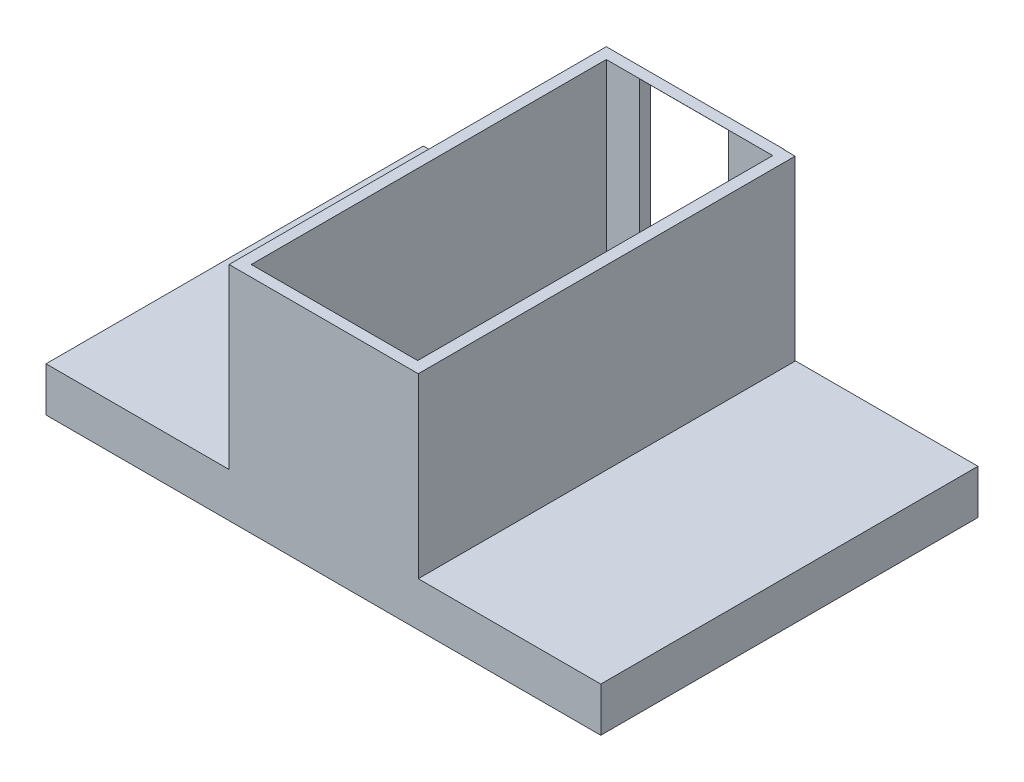
ISO-10303-21;
HEADER;
FILE_DESCRIPTION(('STEP AP214'),'2;1');
FILE_NAME('part.step','',(''),(''),'','','');
FILE_SCHEMA(('AUTOMOTIVE_DESIGN { 1 0 10303 214 1 1 1 1 }'));
ENDSEC;
DATA;
#1=APPLICATION_CONTEXT('core data for automotive mechanical design processes');
#2=APPLICATION_PROTOCOL_DEFINITION('international standard','automotive_design',2000,#1);
#3=PRODUCT_CONTEXT('',#1,'mechanical');
#4=PRODUCT('Part','Part','',(#3));
#5=PRODUCT_RELATED_PRODUCT_CATEGORY('part','',(#4));
#6=PRODUCT_DEFINITION_FORMATION('','',#4);
#7=PRODUCT_DEFINITION_CONTEXT('part definition',#1,'design');
#8=PRODUCT_DEFINITION('design','',#6,#7);
#9=PRODUCT_DEFINITION_SHAPE('','',#8);
#10=(LENGTH_UNIT() NAMED_UNIT(*) SI_UNIT(.MILLI.,.METRE.));
#11=(NAMED_UNIT(*) PLANE_ANGLE_UNIT() SI_UNIT($,.RADIAN.));
#12=(NAMED_UNIT(*) SI_UNIT($,.STERADIAN.) SOLID_ANGLE_UNIT());
#13=UNCERTAINTY_MEASURE_WITH_UNIT(LENGTH_MEASURE(1.E-05),#10,'distance_accuracy_value','');
#14=(GEOMETRIC_REPRESENTATION_CONTEXT(3) GLOBAL_UNCERTAINTY_ASSIGNED_CONTEXT((#13)) GLOBAL_UNIT_ASSIGNED_CONTEXT((#10,
#11,#12)) REPRESENTATION_CONTEXT('',''));
#15=CARTESIAN_POINT('',(0.,0.,0.));
#16=DIRECTION('',(0.,0.,1.));
#17=DIRECTION('',(1.,0.,0.));
#18=AXIS2_PLACEMENT_3D('',#15,#16,#17);
#19=CARTESIAN_POINT('',(0.,5.08,0.));
#20=DIRECTION('',(0.,-1.,0.));
#21=DIRECTION('',(0.,0.,-1.));
#22=AXIS2_PLACEMENT_3D('',#19,#20,#21);
#23=PLANE('',#22);
#24=DIRECTION('',(0.,0.,1.));
#25=VECTOR('',#24,1.);
#26=CARTESIAN_POINT('',(-19.4542193154763,5.08,26.4383336373157));
#27=LINE('',#26,#25);
#28=CARTESIAN_POINT('',(-19.4542193154763,5.08,-15.4716663626843));
#29=VERTEX_POINT('',#28);
#30=CARTESIAN_POINT('',(-19.4542193154763,5.08,25.1683336373157));
#31=VERTEX_POINT('',#30);
#32=EDGE_CURVE('E193',#29,#31,#27,.T.);
#33=ORIENTED_EDGE('',*,*,#32,.F.);
#34=DIRECTION('',(1.,0.,0.));
#35=VECTOR('',#34,1.);
#36=CARTESIAN_POINT('',(-38.5042193154763,5.08,-15.4716663626843));
#37=LINE('',#36,#35);
#38=CARTESIAN_POINT('',(-38.5042193154763,5.08,-15.4716663626843));
#39=VERTEX_POINT('',#38);
#40=EDGE_CURVE('E231',#39,#29,#37,.T.);
#41=ORIENTED_EDGE('',*,*,#40,.F.);
#42=DIRECTION('',(0.,0.,-1.));
#43=VECTOR('',#42,1.);
#44=CARTESIAN_POINT('',(-38.5042193154763,5.08,26.4383336373157));
#45=LINE('',#44,#43);
#46=CARTESIAN_POINT('',(-38.5042193154763,5.08,25.1683336373157));
#47=VERTEX_POINT('',#46);
#48=EDGE_CURVE('E255',#47,#39,#45,.T.);
#49=ORIENTED_EDGE('',*,*,#48,.F.);
#50=DIRECTION('',(1.,0.,0.));
#51=VECTOR('',#50,1.);
#52=CARTESIAN_POINT('',(-38.5042193154763,5.08,25.1683336373157));
#53=LINE('',#52,#51);
#54=EDGE_CURVE('E269',#47,#31,#53,.T.);
#55=ORIENTED_EDGE('',*,*,#54,.T.);
#56=EDGE_LOOP('',(#33,#41,#49,#55));
#57=FACE_BOUND('',#56,.T.);
#58=ADVANCED_FACE('F32',(#57),#23,.F.);
#59=DIRECTION('',(0.,0.,-1.));
#60=VECTOR('',#59,1.);
#61=CARTESIAN_POINT('',(-18.1182186528872,5.08,26.4383336373157));
#62=LINE('',#61,#60);
#63=CARTESIAN_POINT('',(-18.1182186528872,5.08,26.4383336373157));
#64=VERTEX_POINT('',#63);
#65=CARTESIAN_POINT('',(-18.1182186528872,5.08,-16.698347933044));
#66=VERTEX_POINT('',#65);
#67=EDGE_CURVE('E207',#64,#66,#62,.T.);
#68=ORIENTED_EDGE('',*,*,#67,.F.);
#69=DIRECTION('',(1.,0.,0.));
#70=VECTOR('',#69,1.);
#71=CARTESIAN_POINT('',(-60.7292193154763,5.08,26.4383336373157));
#72=LINE('',#71,#70);
#73=CARTESIAN_POINT('',(2.77078068452374,5.08,26.4383336373157));
#74=VERTEX_POINT('',#73);
#75=EDGE_CURVE('E36',#64,#74,#72,.T.);
#76=ORIENTED_EDGE('',*,*,#75,.T.);
#77=DIRECTION('',(0.,0.,-1.));
#78=VECTOR('',#77,1.);
#79=CARTESIAN_POINT('',(2.77078068452374,5.08,26.4383336373157));
#80=LINE('',#79,#78);
#81=CARTESIAN_POINT('',(2.77078068452374,5.08,-16.7416663626843));
#82=VERTEX_POINT('',#81);
#83=EDGE_CURVE('E284',#74,#82,#80,.T.);
#84=ORIENTED_EDGE('',*,*,#83,.T.);
#85=DIRECTION('',(1.,0.,0.));
#86=VECTOR('',#85,1.);
#87=CARTESIAN_POINT('',(-60.7292193154763,5.08,-16.7416663626843));
#88=LINE('',#87,#86);
#89=CARTESIAN_POINT('',(-19.4542193154763,5.08,-16.7416663626843));
#90=VERTEX_POINT('',#89);
#91=EDGE_CURVE('E247',#90,#82,#88,.T.);
#92=ORIENTED_EDGE('',*,*,#91,.F.);
#93=DIRECTION('',(0.,0.,-1.));
#94=VECTOR('',#93,1.);
#95=CARTESIAN_POINT('',(-19.4542193154763,5.08,-15.4716663626843));
#96=LINE('',#95,#94);
#97=CARTESIAN_POINT('',(-19.4542193154763,5.08,-16.698347933044));
#98=VERTEX_POINT('',#97);
#99=EDGE_CURVE('E239',#98,#90,#96,.T.);
#100=ORIENTED_EDGE('',*,*,#99,.F.);
#101=DIRECTION('',(-1.,0.,0.));
#102=VECTOR('',#101,1.);
#103=CARTESIAN_POINT('',(-19.4542193154763,5.08,-16.698347933044));
#104=LINE('',#103,#102);
#105=EDGE_CURVE('E201',#66,#98,#104,.T.);
#106=ORIENTED_EDGE('',*,*,#105,.F.);
#107=EDGE_LOOP('',(#68,#76,#84,#92,#100,#106));
#108=FACE_BOUND('',#107,.T.);
#109=ADVANCED_FACE('F327',(#108),#23,.F.);
#110=CARTESIAN_POINT('',(-19.4542193154763,5.08,-15.4716663626843));
#111=DIRECTION('',(-1.,0.,0.));
#112=DIRECTION('',(0.,-1.,0.));
#113=AXIS2_PLACEMENT_3D('',#110,#111,#112);
#114=PLANE('',#113);
#115=DIRECTION('',(0.,-1.,0.));
#116=VECTOR('',#115,1.);
#117=CARTESIAN_POINT('',(-19.4542193154763,25.4,-16.698347933044));
#118=LINE('',#117,#116);
#119=CARTESIAN_POINT('',(-19.4542193154763,25.4,-16.698347933044));
#120=VERTEX_POINT('',#119);
#121=EDGE_CURVE('E205',#120,#98,#118,.T.);
#122=ORIENTED_EDGE('',*,*,#121,.T.);
#123=ORIENTED_EDGE('',*,*,#99,.T.);
#124=DIRECTION('',(0.,1.,0.));
#125=VECTOR('',#124,1.);
#126=CARTESIAN_POINT('',(-19.4542193154763,5.08,-16.7416663626843));
#127=LINE('',#126,#125);
#128=CARTESIAN_POINT('',(-19.4542193154763,25.4,-16.7416663626843));
#129=VERTEX_POINT('',#128);
#130=EDGE_CURVE('E225',#90,#129,#127,.T.);
#131=ORIENTED_EDGE('',*,*,#130,.T.);
#132=DIRECTION('',(0.,0.,-1.));
#133=VECTOR('',#132,1.);
#134=CARTESIAN_POINT('',(-19.4542193154763,25.4,-15.4716663626843));
#135=LINE('',#134,#133);
#136=EDGE_CURVE('E234',#120,#129,#135,.T.);
#137=ORIENTED_EDGE('',*,*,#136,.F.);
#138=EDGE_LOOP('',(#122,#123,#131,#137));
#139=FACE_BOUND('',#138,.T.);
#140=ADVANCED_FACE('F332',(#139),#114,.F.);
#141=DIRECTION('',(0.,0.,1.));
#142=VECTOR('',#141,1.);
#143=CARTESIAN_POINT('',(-39.7742193154763,5.08,26.4383336373157));
#144=LINE('',#143,#142);
#145=CARTESIAN_POINT('',(-39.7742193154763,5.08,-16.7416663626843));
#146=VERTEX_POINT('',#145);
#147=CARTESIAN_POINT('',(-39.7742193154763,5.08,26.4383336373157));
#148=VERTEX_POINT('',#147);
#149=EDGE_CURVE('E259',#146,#148,#144,.T.);
#150=ORIENTED_EDGE('',*,*,#149,.F.);
#151=CARTESIAN_POINT('',(-60.7292193154763,5.08,-16.7416663626843));
#152=VERTEX_POINT('',#151);
#153=EDGE_CURVE('E243',#152,#146,#88,.T.);
#154=ORIENTED_EDGE('',*,*,#153,.F.);
#155=DIRECTION('',(0.,0.,1.));
#156=VECTOR('',#155,1.);
#157=CARTESIAN_POINT('',(-60.7292193154763,5.08,26.4383336373157));
#158=LINE('',#157,#156);
#159=CARTESIAN_POINT('',(-60.7292193154763,5.08,26.4383336373157));
#160=VERTEX_POINT('',#159);
#161=EDGE_CURVE('E279',#152,#160,#158,.T.);
#162=ORIENTED_EDGE('',*,*,#161,.T.);
#163=EDGE_CURVE('E288',#160,#148,#72,.T.);
#164=ORIENTED_EDGE('',*,*,#163,.T.);
#165=EDGE_LOOP('',(#150,#154,#162,#164));
#166=FACE_BOUND('',#165,.T.);
#167=ADVANCED_FACE('F328',(#166),#23,.F.);
#168=CARTESIAN_POINT('',(-60.7292193154763,5.08,26.4383336373157));
#169=DIRECTION('',(1.,0.,0.));
#170=DIRECTION('',(0.,0.,-1.));
#171=AXIS2_PLACEMENT_3D('',#168,#169,#170);
#172=PLANE('',#171);
#173=DIRECTION('',(0.,0.,1.));
#174=VECTOR('',#173,1.);
#175=CARTESIAN_POINT('',(-60.7292193154763,0.,26.4383336373157));
#176=LINE('',#175,#174);
#177=CARTESIAN_POINT('',(-60.7292193154763,0.,-16.7416663626843));
#178=VERTEX_POINT('',#177);
#179=CARTESIAN_POINT('',(-60.7292193154763,0.,26.4383336373157));
#180=VERTEX_POINT('',#179);
#181=EDGE_CURVE('E277',#178,#180,#176,.T.);
#182=ORIENTED_EDGE('',*,*,#181,.T.);
#183=DIRECTION('',(0.,-1.,0.));
#184=VECTOR('',#183,1.);
#185=CARTESIAN_POINT('',(-60.7292193154763,5.08,26.4383336373157));
#186=LINE('',#185,#184);
#187=EDGE_CURVE('E11',#160,#180,#186,.T.);
#188=ORIENTED_EDGE('',*,*,#187,.F.);
#189=ORIENTED_EDGE('',*,*,#161,.F.);
#190=DIRECTION('',(0.,-1.,0.));
#191=VECTOR('',#190,1.);
#192=CARTESIAN_POINT('',(-60.7292193154763,5.08,-16.7416663626843));
#193=LINE('',#192,#191);
#194=EDGE_CURVE('E246',#152,#178,#193,.T.);
#195=ORIENTED_EDGE('',*,*,#194,.T.);
#196=EDGE_LOOP('',(#182,#188,#189,#195));
#197=FACE_BOUND('',#196,.T.);
#198=ADVANCED_FACE('F34',(#197),#172,.F.);
#199=CARTESIAN_POINT('',(-60.7292193154763,5.08,26.4383336373157));
#200=DIRECTION('',(0.,0.,-1.));
#201=DIRECTION('',(-1.,0.,0.));
#202=AXIS2_PLACEMENT_3D('',#199,#200,#201);
#203=PLANE('',#202);
#204=ORIENTED_EDGE('',*,*,#75,.F.);
#205=DIRECTION('',(0.,-1.,0.));
#206=VECTOR('',#205,1.);
#207=CARTESIAN_POINT('',(-18.1182186528872,25.4,26.4383336373157));
#208=LINE('',#207,#206);
#209=CARTESIAN_POINT('',(-18.1182186528872,25.4,26.4383336373157));
#210=VERTEX_POINT('',#209);
#211=EDGE_CURVE('E215',#210,#64,#208,.T.);
#212=ORIENTED_EDGE('',*,*,#211,.F.);
#213=DIRECTION('',(-1.,0.,0.));
#214=VECTOR('',#213,1.);
#215=CARTESIAN_POINT('',(-38.5042193154763,25.4,26.4383336373157));
#216=LINE('',#215,#214);
#217=CARTESIAN_POINT('',(-39.7742193154763,25.4,26.4383336373157));
#218=VERTEX_POINT('',#217);
#219=EDGE_CURVE('E265',#210,#218,#216,.T.);
#220=ORIENTED_EDGE('',*,*,#219,.T.);
#221=DIRECTION('',(0.,-1.,0.));
#222=VECTOR('',#221,1.);
#223=CARTESIAN_POINT('',(-39.7742193154763,25.4,26.4383336373157));
#224=LINE('',#223,#222);
#225=EDGE_CURVE('E262',#218,#148,#224,.T.);
#226=ORIENTED_EDGE('',*,*,#225,.T.);
#227=ORIENTED_EDGE('',*,*,#163,.F.);
#228=ORIENTED_EDGE('',*,*,#187,.T.);
#229=DIRECTION('',(1.,0.,0.));
#230=VECTOR('',#229,1.);
#231=CARTESIAN_POINT('',(-60.7292193154763,0.,26.4383336373157));
#232=LINE('',#231,#230);
#233=CARTESIAN_POINT('',(2.77078068452374,0.,26.4383336373157));
#234=VERTEX_POINT('',#233);
#235=EDGE_CURVE('E359',#180,#234,#232,.T.);
#236=ORIENTED_EDGE('',*,*,#235,.T.);
#237=DIRECTION('',(0.,-1.,0.));
#238=VECTOR('',#237,1.);
#239=CARTESIAN_POINT('',(2.77078068452374,5.08,26.4383336373157));
#240=LINE('',#239,#238);
#241=EDGE_CURVE('E42',#74,#234,#240,.T.);
#242=ORIENTED_EDGE('',*,*,#241,.F.);
#243=EDGE_LOOP('',(#204,#212,#220,#226,#227,#228,#236,#242));
#244=FACE_BOUND('',#243,.T.);
#245=ADVANCED_FACE('F340',(#244),#203,.F.);
#246=CARTESIAN_POINT('',(2.77078068452374,5.08,26.4383336373157));
#247=DIRECTION('',(-1.,0.,0.));
#248=DIRECTION('',(0.,0.,1.));
#249=AXIS2_PLACEMENT_3D('',#246,#247,#248);
#250=PLANE('',#249);
#251=DIRECTION('',(0.,0.,-1.));
#252=VECTOR('',#251,1.);
#253=CARTESIAN_POINT('',(2.77078068452374,0.,26.4383336373157));
#254=LINE('',#253,#252);
#255=CARTESIAN_POINT('',(2.77078068452374,0.,-16.7416663626843));
#256=VERTEX_POINT('',#255);
#257=EDGE_CURVE('E281',#234,#256,#254,.T.);
#258=ORIENTED_EDGE('',*,*,#257,.T.);
#259=DIRECTION('',(0.,-1.,0.));
#260=VECTOR('',#259,1.);
#261=CARTESIAN_POINT('',(2.77078068452374,5.08,-16.7416663626843));
#262=LINE('',#261,#260);
#263=EDGE_CURVE('E252',#82,#256,#262,.T.);
#264=ORIENTED_EDGE('',*,*,#263,.F.);
#265=ORIENTED_EDGE('',*,*,#83,.F.);
#266=ORIENTED_EDGE('',*,*,#241,.T.);
#267=EDGE_LOOP('',(#258,#264,#265,#266));
#268=FACE_BOUND('',#267,.T.);
#269=ADVANCED_FACE('F322',(#268),#250,.F.);
#270=CARTESIAN_POINT('',(0.,0.,0.));
#271=DIRECTION('',(0.,-1.,0.));
#272=DIRECTION('',(0.,0.,-1.));
#273=AXIS2_PLACEMENT_3D('',#270,#271,#272);
#274=PLANE('',#273);
#275=ORIENTED_EDGE('',*,*,#181,.F.);
#276=DIRECTION('',(1.,0.,0.));
#277=VECTOR('',#276,1.);
#278=CARTESIAN_POINT('',(-60.7292193154763,0.,-16.7416663626843));
#279=LINE('',#278,#277);
#280=EDGE_CURVE('E241',#178,#256,#279,.T.);
#281=ORIENTED_EDGE('',*,*,#280,.T.);
#282=ORIENTED_EDGE('',*,*,#257,.F.);
#283=ORIENTED_EDGE('',*,*,#235,.F.);
#284=EDGE_LOOP('',(#275,#281,#282,#283));
#285=FACE_BOUND('',#284,.T.);
#286=ADVANCED_FACE('F314',(#285),#274,.T.);
#287=CARTESIAN_POINT('',(-38.5042193154763,25.4,25.1683336373157));
#288=DIRECTION('',(0.,1.,0.));
#289=DIRECTION('',(-1.,0.,0.));
#290=AXIS2_PLACEMENT_3D('',#287,#288,#289);
#291=PLANE('',#290);
#292=ORIENTED_EDGE('',*,*,#219,.F.);
#293=DIRECTION('',(0.,0.,-1.));
#294=VECTOR('',#293,1.);
#295=CARTESIAN_POINT('',(-18.1182186528872,25.4,26.4383336373157));
#296=LINE('',#295,#294);
#297=CARTESIAN_POINT('',(-18.1182186528872,25.4,-16.698347933044));
#298=VERTEX_POINT('',#297);
#299=EDGE_CURVE('E200',#210,#298,#296,.T.);
#300=ORIENTED_EDGE('',*,*,#299,.T.);
#301=DIRECTION('',(-1.,0.,0.));
#302=VECTOR('',#301,1.);
#303=CARTESIAN_POINT('',(-19.4542193154763,25.4,-16.698347933044));
#304=LINE('',#303,#302);
#305=EDGE_CURVE('E203',#298,#120,#304,.T.);
#306=ORIENTED_EDGE('',*,*,#305,.T.);
#307=ORIENTED_EDGE('',*,*,#136,.T.);
#308=DIRECTION('',(-1.,0.,0.));
#309=VECTOR('',#308,1.);
#310=CARTESIAN_POINT('',(-38.5042193154763,25.4,-16.7416663626843));
#311=LINE('',#310,#309);
#312=CARTESIAN_POINT('',(-39.7742193154763,25.4,-16.7416663626843));
#313=VERTEX_POINT('',#312);
#314=EDGE_CURVE('E220',#129,#313,#311,.T.);
#315=ORIENTED_EDGE('',*,*,#314,.T.);
#316=DIRECTION('',(0.,0.,1.));
#317=VECTOR('',#316,1.);
#318=CARTESIAN_POINT('',(-39.7742193154763,25.4,26.4383336373157));
#319=LINE('',#318,#317);
#320=EDGE_CURVE('E258',#313,#218,#319,.T.);
#321=ORIENTED_EDGE('',*,*,#320,.T.);
#322=EDGE_LOOP('',(#292,#300,#306,#307,#315,#321));
#323=FACE_BOUND('',#322,.T.);
#324=DIRECTION('',(0.,0.,1.));
#325=VECTOR('',#324,1.);
#326=CARTESIAN_POINT('',(-19.4542193154763,25.4,26.4383336373157));
#327=LINE('',#326,#325);
#328=CARTESIAN_POINT('',(-19.4542193154763,25.4,-15.4716663626843));
#329=VERTEX_POINT('',#328);
#330=CARTESIAN_POINT('',(-19.4542193154763,25.4,25.1683336373157));
#331=VERTEX_POINT('',#330);
#332=EDGE_CURVE('E197',#329,#331,#327,.T.);
#333=ORIENTED_EDGE('',*,*,#332,.T.);
#334=DIRECTION('',(-1.,0.,0.));
#335=VECTOR('',#334,1.);
#336=CARTESIAN_POINT('',(-38.5042193154763,25.4,25.1683336373157));
#337=LINE('',#336,#335);
#338=CARTESIAN_POINT('',(-38.5042193154763,25.4,25.1683336373157));
#339=VERTEX_POINT('',#338);
#340=EDGE_CURVE('E274',#331,#339,#337,.T.);
#341=ORIENTED_EDGE('',*,*,#340,.T.);
#342=DIRECTION('',(0.,0.,-1.));
#343=VECTOR('',#342,1.);
#344=CARTESIAN_POINT('',(-38.5042193154763,25.4,26.4383336373157));
#345=LINE('',#344,#343);
#346=CARTESIAN_POINT('',(-38.5042193154763,25.4,-15.4716663626843));
#347=VERTEX_POINT('',#346);
#348=EDGE_CURVE('E256',#339,#347,#345,.T.);
#349=ORIENTED_EDGE('',*,*,#348,.T.);
#350=DIRECTION('',(-1.,0.,0.));
#351=VECTOR('',#350,1.);
#352=CARTESIAN_POINT('',(-38.5042193154763,25.4,-15.4716663626843));
#353=LINE('',#352,#351);
#354=EDGE_CURVE('E224',#329,#347,#353,.T.);
#355=ORIENTED_EDGE('',*,*,#354,.F.);
#356=EDGE_LOOP('',(#333,#341,#349,#355));
#357=FACE_BOUND('',#356,.T.);
#358=ADVANCED_FACE('F312',(#323,#357),#291,.T.);
#359=CARTESIAN_POINT('',(0.,0.,25.1683336373157));
#360=DIRECTION('',(0.,0.,-1.));
#361=DIRECTION('',(-1.,0.,0.));
#362=AXIS2_PLACEMENT_3D('',#359,#360,#361);
#363=PLANE('',#362);
#364=DIRECTION('',(0.,-1.,0.));
#365=VECTOR('',#364,1.);
#366=CARTESIAN_POINT('',(-38.5042193154763,5.08,25.1683336373157));
#367=LINE('',#366,#365);
#368=EDGE_CURVE('E266',#339,#47,#367,.T.);
#369=ORIENTED_EDGE('',*,*,#368,.F.);
#370=ORIENTED_EDGE('',*,*,#340,.F.);
#371=DIRECTION('',(0.,1.,0.));
#372=VECTOR('',#371,1.);
#373=CARTESIAN_POINT('',(-19.4542193154763,5.08,25.1683336373157));
#374=LINE('',#373,#372);
#375=EDGE_CURVE('E272',#31,#331,#374,.T.);
#376=ORIENTED_EDGE('',*,*,#375,.F.);
#377=ORIENTED_EDGE('',*,*,#54,.F.);
#378=EDGE_LOOP('',(#369,#370,#376,#377));
#379=FACE_BOUND('',#378,.T.);
#380=ADVANCED_FACE('F310',(#379),#363,.T.);
#381=CARTESIAN_POINT('',(-38.5042193154763,25.4,26.4383336373157));
#382=DIRECTION('',(-1.,0.,0.));
#383=DIRECTION('',(0.,0.,1.));
#384=AXIS2_PLACEMENT_3D('',#381,#382,#383);
#385=PLANE('',#384);
#386=ORIENTED_EDGE('',*,*,#368,.T.);
#387=ORIENTED_EDGE('',*,*,#48,.T.);
#388=DIRECTION('',(0.,-1.,0.));
#389=VECTOR('',#388,1.);
#390=CARTESIAN_POINT('',(-38.5042193154763,5.08,-15.4716663626843));
#391=LINE('',#390,#389);
#392=EDGE_CURVE('E221',#347,#39,#391,.T.);
#393=ORIENTED_EDGE('',*,*,#392,.F.);
#394=ORIENTED_EDGE('',*,*,#348,.F.);
#395=EDGE_LOOP('',(#386,#387,#393,#394));
#396=FACE_BOUND('',#395,.T.);
#397=ADVANCED_FACE('F299',(#396),#385,.F.);
#398=CARTESIAN_POINT('',(-39.7742193154763,25.4,26.4383336373157));
#399=DIRECTION('',(1.,0.,0.));
#400=DIRECTION('',(0.,0.,-1.));
#401=AXIS2_PLACEMENT_3D('',#398,#399,#400);
#402=PLANE('',#401);
#403=ORIENTED_EDGE('',*,*,#149,.T.);
#404=ORIENTED_EDGE('',*,*,#225,.F.);
#405=ORIENTED_EDGE('',*,*,#320,.F.);
#406=DIRECTION('',(0.,-1.,0.));
#407=VECTOR('',#406,1.);
#408=CARTESIAN_POINT('',(-39.7742193154763,25.4,-16.7416663626843));
#409=LINE('',#408,#407);
#410=EDGE_CURVE('E217',#313,#146,#409,.T.);
#411=ORIENTED_EDGE('',*,*,#410,.T.);
#412=EDGE_LOOP('',(#403,#404,#405,#411));
#413=FACE_BOUND('',#412,.T.);
#414=ADVANCED_FACE('F348',(#413),#402,.F.);
#415=CARTESIAN_POINT('',(-60.7292193154763,5.08,-16.7416663626843));
#416=DIRECTION('',(0.,0.,-1.));
#417=DIRECTION('',(-1.,0.,0.));
#418=AXIS2_PLACEMENT_3D('',#415,#416,#417);
#419=PLANE('',#418);
#420=DIRECTION('',(0.,-1.,0.));
#421=VECTOR('',#420,1.);
#422=CARTESIAN_POINT('',(-24.5333876448892,5.17191888537368,-16.7416663626843));
#423=LINE('',#422,#421);
#424=CARTESIAN_POINT('',(-24.5333876448892,25.3871120678787,-16.7416663626843));
#425=VERTEX_POINT('',#424);
#426=CARTESIAN_POINT('',(-24.5333876448892,5.17191888537368,-16.7416663626843));
#427=VERTEX_POINT('',#426);
#428=EDGE_CURVE('E50',#425,#427,#423,.T.);
#429=ORIENTED_EDGE('',*,*,#428,.F.);
#430=DIRECTION('',(1.,0.,0.));
#431=VECTOR('',#430,1.);
#432=CARTESIAN_POINT('',(-24.5333876448892,25.3871120678787,-16.7416663626843));
#433=LINE('',#432,#431);
#434=CARTESIAN_POINT('',(-34.6933876448892,25.3871120678787,-16.7416663626843));
#435=VERTEX_POINT('',#434);
#436=EDGE_CURVE('E178',#435,#425,#433,.T.);
#437=ORIENTED_EDGE('',*,*,#436,.F.);
#438=DIRECTION('',(0.,1.,0.));
#439=VECTOR('',#438,1.);
#440=CARTESIAN_POINT('',(-34.6933876448892,5.17191888537368,-16.7416663626843));
#441=LINE('',#440,#439);
#442=CARTESIAN_POINT('',(-34.6933876448892,5.17191888537368,-16.7416663626843));
#443=VERTEX_POINT('',#442);
#444=EDGE_CURVE('E181',#443,#435,#441,.T.);
#445=ORIENTED_EDGE('',*,*,#444,.F.);
#446=DIRECTION('',(-1.,0.,0.));
#447=VECTOR('',#446,1.);
#448=CARTESIAN_POINT('',(-24.5333876448892,5.17191888537368,-16.7416663626843));
#449=LINE('',#448,#447);
#450=EDGE_CURVE('E187',#427,#443,#449,.T.);
#451=ORIENTED_EDGE('',*,*,#450,.F.);
#452=EDGE_LOOP('',(#429,#437,#445,#451));
#453=FACE_BOUND('',#452,.T.);
#454=ORIENTED_EDGE('',*,*,#280,.F.);
#455=ORIENTED_EDGE('',*,*,#194,.F.);
#456=ORIENTED_EDGE('',*,*,#153,.T.);
#457=ORIENTED_EDGE('',*,*,#410,.F.);
#458=ORIENTED_EDGE('',*,*,#314,.F.);
#459=ORIENTED_EDGE('',*,*,#130,.F.);
#460=ORIENTED_EDGE('',*,*,#91,.T.);
#461=ORIENTED_EDGE('',*,*,#263,.T.);
#462=EDGE_LOOP('',(#454,#455,#456,#457,#458,#459,#460,#461));
#463=FACE_BOUND('',#462,.T.);
#464=ADVANCED_FACE('F353',(#453,#463),#419,.T.);
#465=CARTESIAN_POINT('',(0.,0.,-15.4716663626843));
#466=DIRECTION('',(0.,0.,1.));
#467=DIRECTION('',(-1.,0.,0.));
#468=AXIS2_PLACEMENT_3D('',#465,#466,#467);
#469=PLANE('',#468);
#470=DIRECTION('',(0.,-1.,0.));
#471=VECTOR('',#470,1.);
#472=CARTESIAN_POINT('',(-24.5333876448892,5.17191888537368,-15.4716663626843));
#473=LINE('',#472,#471);
#474=CARTESIAN_POINT('',(-24.5333876448892,25.3871120678787,-15.4716663626843));
#475=VERTEX_POINT('',#474);
#476=CARTESIAN_POINT('',(-24.5333876448892,5.17191888537368,-15.4716663626843));
#477=VERTEX_POINT('',#476);
#478=EDGE_CURVE('E162',#475,#477,#473,.T.);
#479=ORIENTED_EDGE('',*,*,#478,.T.);
#480=DIRECTION('',(-1.,0.,0.));
#481=VECTOR('',#480,1.);
#482=CARTESIAN_POINT('',(-24.5333876448892,5.17191888537368,-15.4716663626843));
#483=LINE('',#482,#481);
#484=CARTESIAN_POINT('',(-34.6933876448892,5.17191888537368,-15.4716663626843));
#485=VERTEX_POINT('',#484);
#486=EDGE_CURVE('E171',#477,#485,#483,.T.);
#487=ORIENTED_EDGE('',*,*,#486,.T.);
#488=DIRECTION('',(0.,1.,0.));
#489=VECTOR('',#488,1.);
#490=CARTESIAN_POINT('',(-34.6933876448892,5.17191888537368,-15.4716663626843));
#491=LINE('',#490,#489);
#492=CARTESIAN_POINT('',(-34.6933876448892,25.3871120678787,-15.4716663626843));
#493=VERTEX_POINT('',#492);
#494=EDGE_CURVE('E58',#485,#493,#491,.T.);
#495=ORIENTED_EDGE('',*,*,#494,.T.);
#496=DIRECTION('',(1.,0.,0.));
#497=VECTOR('',#496,1.);
#498=CARTESIAN_POINT('',(-24.5333876448892,25.3871120678787,-15.4716663626843));
#499=LINE('',#498,#497);
#500=EDGE_CURVE('E168',#493,#475,#499,.T.);
#501=ORIENTED_EDGE('',*,*,#500,.T.);
#502=EDGE_LOOP('',(#479,#487,#495,#501));
#503=FACE_BOUND('',#502,.T.);
#504=ORIENTED_EDGE('',*,*,#392,.T.);
#505=ORIENTED_EDGE('',*,*,#40,.T.);
#506=DIRECTION('',(0.,1.,0.));
#507=VECTOR('',#506,1.);
#508=CARTESIAN_POINT('',(-19.4542193154763,5.08,-15.4716663626843));
#509=LINE('',#508,#507);
#510=EDGE_CURVE('E228',#29,#329,#509,.T.);
#511=ORIENTED_EDGE('',*,*,#510,.T.);
#512=ORIENTED_EDGE('',*,*,#354,.T.);
#513=EDGE_LOOP('',(#504,#505,#511,#512));
#514=FACE_BOUND('',#513,.T.);
#515=ADVANCED_FACE('F175',(#503,#514),#469,.T.);
#516=CARTESIAN_POINT('',(-19.4542193154763,25.4,26.4383336373157));
#517=DIRECTION('',(1.,0.,0.));
#518=DIRECTION('',(0.,0.,-1.));
#519=AXIS2_PLACEMENT_3D('',#516,#517,#518);
#520=PLANE('',#519);
#521=ORIENTED_EDGE('',*,*,#375,.T.);
#522=ORIENTED_EDGE('',*,*,#332,.F.);
#523=ORIENTED_EDGE('',*,*,#510,.F.);
#524=ORIENTED_EDGE('',*,*,#32,.T.);
#525=EDGE_LOOP('',(#521,#522,#523,#524));
#526=FACE_BOUND('',#525,.T.);
#527=ADVANCED_FACE('F307',(#526),#520,.F.);
#528=CARTESIAN_POINT('',(-18.1182186528872,25.4,26.4383336373157));
#529=DIRECTION('',(-1.,0.,0.));
#530=DIRECTION('',(0.,0.,1.));
#531=AXIS2_PLACEMENT_3D('',#528,#529,#530);
#532=PLANE('',#531);
#533=ORIENTED_EDGE('',*,*,#67,.T.);
#534=DIRECTION('',(0.,-1.,0.));
#535=VECTOR('',#534,1.);
#536=CARTESIAN_POINT('',(-18.1182186528872,25.4,-16.698347933044));
#537=LINE('',#536,#535);
#538=EDGE_CURVE('E212',#298,#66,#537,.T.);
#539=ORIENTED_EDGE('',*,*,#538,.F.);
#540=ORIENTED_EDGE('',*,*,#299,.F.);
#541=ORIENTED_EDGE('',*,*,#211,.T.);
#542=EDGE_LOOP('',(#533,#539,#540,#541));
#543=FACE_BOUND('',#542,.T.);
#544=ADVANCED_FACE('F511',(#543),#532,.F.);
#545=CARTESIAN_POINT('',(-19.4542193154763,25.4,-16.698347933044));
#546=DIRECTION('',(0.,0.,1.));
#547=DIRECTION('',(1.,0.,0.));
#548=AXIS2_PLACEMENT_3D('',#545,#546,#547);
#549=PLANE('',#548);
#550=ORIENTED_EDGE('',*,*,#105,.T.);
#551=ORIENTED_EDGE('',*,*,#121,.F.);
#552=ORIENTED_EDGE('',*,*,#305,.F.);
#553=ORIENTED_EDGE('',*,*,#538,.T.);
#554=EDGE_LOOP('',(#550,#551,#552,#553));
#555=FACE_BOUND('',#554,.T.);
#556=ADVANCED_FACE('F462',(#555),#549,.F.);
#557=CARTESIAN_POINT('',(-24.5333876448892,5.17191888537368,-15.4716663626843));
#558=DIRECTION('',(1.,0.,0.));
#559=DIRECTION('',(0.,0.,-1.));
#560=AXIS2_PLACEMENT_3D('',#557,#558,#559);
#561=PLANE('',#560);
#562=ORIENTED_EDGE('',*,*,#428,.T.);
#563=DIRECTION('',(0.,0.,-1.));
#564=VECTOR('',#563,1.);
#565=CARTESIAN_POINT('',(-24.5333876448892,5.17191888537368,-15.4716663626843));
#566=LINE('',#565,#564);
#567=EDGE_CURVE('E158',#477,#427,#566,.T.);
#568=ORIENTED_EDGE('',*,*,#567,.F.);
#569=ORIENTED_EDGE('',*,*,#478,.F.);
#570=DIRECTION('',(0.,0.,-1.));
#571=VECTOR('',#570,1.);
#572=CARTESIAN_POINT('',(-24.5333876448892,25.3871120678787,-15.4716663626843));
#573=LINE('',#572,#571);
#574=EDGE_CURVE('E191',#475,#425,#573,.T.);
#575=ORIENTED_EDGE('',*,*,#574,.T.);
#576=EDGE_LOOP('',(#562,#568,#569,#575));
#577=FACE_BOUND('',#576,.T.);
#578=ADVANCED_FACE('F160',(#577),#561,.F.);
#579=CARTESIAN_POINT('',(-24.5333876448892,25.3871120678787,-15.4716663626843));
#580=DIRECTION('',(0.,1.,0.));
#581=DIRECTION('',(-1.,0.,0.));
#582=AXIS2_PLACEMENT_3D('',#579,#580,#581);
#583=PLANE('',#582);
#584=ORIENTED_EDGE('',*,*,#436,.T.);
#585=ORIENTED_EDGE('',*,*,#574,.F.);
#586=ORIENTED_EDGE('',*,*,#500,.F.);
#587=DIRECTION('',(0.,0.,-1.));
#588=VECTOR('',#587,1.);
#589=CARTESIAN_POINT('',(-34.6933876448892,25.3871120678787,-15.4716663626843));
#590=LINE('',#589,#588);
#591=EDGE_CURVE('E194',#493,#435,#590,.T.);
#592=ORIENTED_EDGE('',*,*,#591,.T.);
#593=EDGE_LOOP('',(#584,#585,#586,#592));
#594=FACE_BOUND('',#593,.T.);
#595=ADVANCED_FACE('F479',(#594),#583,.F.);
#596=CARTESIAN_POINT('',(-34.6933876448892,5.17191888537368,-15.4716663626843));
#597=DIRECTION('',(-1.,0.,0.));
#598=DIRECTION('',(0.,0.,1.));
#599=AXIS2_PLACEMENT_3D('',#596,#597,#598);
#600=PLANE('',#599);
#601=ORIENTED_EDGE('',*,*,#444,.T.);
#602=ORIENTED_EDGE('',*,*,#591,.F.);
#603=ORIENTED_EDGE('',*,*,#494,.F.);
#604=DIRECTION('',(0.,0.,-1.));
#605=VECTOR('',#604,1.);
#606=CARTESIAN_POINT('',(-34.6933876448892,5.17191888537368,-15.4716663626843));
#607=LINE('',#606,#605);
#608=EDGE_CURVE('E167',#485,#443,#607,.T.);
#609=ORIENTED_EDGE('',*,*,#608,.T.);
#610=EDGE_LOOP('',(#601,#602,#603,#609));
#611=FACE_BOUND('',#610,.T.);
#612=ADVANCED_FACE('F488',(#611),#600,.F.);
#613=CARTESIAN_POINT('',(-24.5333876448892,5.17191888537368,-15.4716663626843));
#614=DIRECTION('',(0.,-1.,0.));
#615=DIRECTION('',(0.,0.,-1.));
#616=AXIS2_PLACEMENT_3D('',#613,#614,#615);
#617=PLANE('',#616);
#618=ORIENTED_EDGE('',*,*,#450,.T.);
#619=ORIENTED_EDGE('',*,*,#608,.F.);
#620=ORIENTED_EDGE('',*,*,#486,.F.);
#621=ORIENTED_EDGE('',*,*,#567,.T.);
#622=EDGE_LOOP('',(#618,#619,#620,#621));
#623=FACE_BOUND('',#622,.T.);
#624=ADVANCED_FACE('F172',(#623),#617,.F.);
#625=CLOSED_SHELL('',(#58,#109,#140,#167,#198,#245,#269,#286,#358,#380,#397,#414,#464,#515,#527,
#544,#556,#578,#595,#612,#624));
#626=MANIFOLD_SOLID_BREP('B2',#625);
#627=ADVANCED_BREP_SHAPE_REPRESENTATION('',(#18,#626),#14);
#628=SHAPE_DEFINITION_REPRESENTATION(#9,#627);
ENDSEC;
END-ISO-10303-21;
